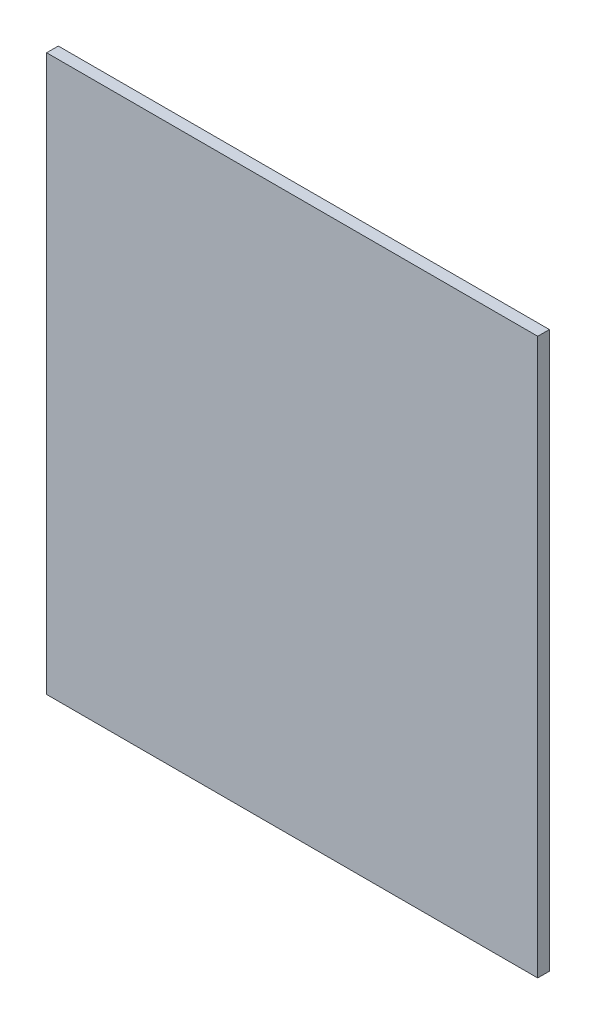
ISO-10303-21;
HEADER;
FILE_DESCRIPTION(('STEP AP214'),'2;1');
FILE_NAME('part.step','',(''),(''),'','','');
FILE_SCHEMA(('AUTOMOTIVE_DESIGN { 1 0 10303 214 1 1 1 1 }'));
ENDSEC;
DATA;
#1=APPLICATION_CONTEXT('core data for automotive mechanical design processes');
#2=APPLICATION_PROTOCOL_DEFINITION('international standard','automotive_design',2000,#1);
#3=PRODUCT_CONTEXT('',#1,'mechanical');
#4=PRODUCT('Part','Part','',(#3));
#5=PRODUCT_RELATED_PRODUCT_CATEGORY('part','',(#4));
#6=PRODUCT_DEFINITION_FORMATION('','',#4);
#7=PRODUCT_DEFINITION_CONTEXT('part definition',#1,'design');
#8=PRODUCT_DEFINITION('design','',#6,#7);
#9=PRODUCT_DEFINITION_SHAPE('','',#8);
#10=(LENGTH_UNIT() NAMED_UNIT(*) SI_UNIT(.MILLI.,.METRE.));
#11=(NAMED_UNIT(*) PLANE_ANGLE_UNIT() SI_UNIT($,.RADIAN.));
#12=(NAMED_UNIT(*) SI_UNIT($,.STERADIAN.) SOLID_ANGLE_UNIT());
#13=UNCERTAINTY_MEASURE_WITH_UNIT(LENGTH_MEASURE(1.E-05),#10,'distance_accuracy_value','');
#14=(GEOMETRIC_REPRESENTATION_CONTEXT(3) GLOBAL_UNCERTAINTY_ASSIGNED_CONTEXT((#13)) GLOBAL_UNIT_ASSIGNED_CONTEXT((#10,
#11,#12)) REPRESENTATION_CONTEXT('',''));
#15=CARTESIAN_POINT('',(0.,0.,0.));
#16=DIRECTION('',(0.,0.,1.));
#17=DIRECTION('',(1.,0.,0.));
#18=AXIS2_PLACEMENT_3D('',#15,#16,#17);
#19=CARTESIAN_POINT('',(0.,0.,12.7));
#20=DIRECTION('',(1.,0.,0.));
#21=DIRECTION('',(0.,0.,-1.));
#22=AXIS2_PLACEMENT_3D('',#19,#20,#21);
#23=PLANE('',#22);
#24=DIRECTION('',(0.,-1.,0.));
#25=VECTOR('',#24,1.);
#26=CARTESIAN_POINT('',(0.,0.,0.));
#27=LINE('',#26,#25);
#28=CARTESIAN_POINT('',(0.,605.,0.));
#29=VERTEX_POINT('',#28);
#30=CARTESIAN_POINT('',(0.,0.,0.));
#31=VERTEX_POINT('',#30);
#32=EDGE_CURVE('E107',#29,#31,#27,.T.);
#33=ORIENTED_EDGE('',*,*,#32,.T.);
#34=DIRECTION('',(0.,0.,-1.));
#35=VECTOR('',#34,1.);
#36=CARTESIAN_POINT('',(0.,0.,12.7));
#37=LINE('',#36,#35);
#38=CARTESIAN_POINT('',(0.,0.,12.7));
#39=VERTEX_POINT('',#38);
#40=EDGE_CURVE('E11',#39,#31,#37,.T.);
#41=ORIENTED_EDGE('',*,*,#40,.F.);
#42=DIRECTION('',(0.,-1.,0.));
#43=VECTOR('',#42,1.);
#44=CARTESIAN_POINT('',(0.,0.,12.7));
#45=LINE('',#44,#43);
#46=CARTESIAN_POINT('',(0.,605.,12.7));
#47=VERTEX_POINT('',#46);
#48=EDGE_CURVE('E91',#47,#39,#45,.T.);
#49=ORIENTED_EDGE('',*,*,#48,.F.);
#50=DIRECTION('',(0.,0.,-1.));
#51=VECTOR('',#50,1.);
#52=CARTESIAN_POINT('',(0.,605.,12.7));
#53=LINE('',#52,#51);
#54=EDGE_CURVE('E103',#47,#29,#53,.T.);
#55=ORIENTED_EDGE('',*,*,#54,.T.);
#56=EDGE_LOOP('',(#33,#41,#49,#55));
#57=FACE_BOUND('',#56,.T.);
#58=ADVANCED_FACE('F39',(#57),#23,.F.);
#59=CARTESIAN_POINT('',(0.,0.,12.7));
#60=DIRECTION('',(0.,1.,0.));
#61=DIRECTION('',(0.,0.,1.));
#62=AXIS2_PLACEMENT_3D('',#59,#60,#61);
#63=PLANE('',#62);
#64=DIRECTION('',(1.,0.,0.));
#65=VECTOR('',#64,1.);
#66=CARTESIAN_POINT('',(0.,0.,0.));
#67=LINE('',#66,#65);
#68=CARTESIAN_POINT('',(534.6,0.,0.));
#69=VERTEX_POINT('',#68);
#70=EDGE_CURVE('E96',#31,#69,#67,.T.);
#71=ORIENTED_EDGE('',*,*,#70,.T.);
#72=DIRECTION('',(0.,0.,-1.));
#73=VECTOR('',#72,1.);
#74=CARTESIAN_POINT('',(534.6,0.,12.7));
#75=LINE('',#74,#73);
#76=CARTESIAN_POINT('',(534.6,0.,12.7));
#77=VERTEX_POINT('',#76);
#78=EDGE_CURVE('E48',#77,#69,#75,.T.);
#79=ORIENTED_EDGE('',*,*,#78,.F.);
#80=DIRECTION('',(1.,0.,0.));
#81=VECTOR('',#80,1.);
#82=CARTESIAN_POINT('',(0.,0.,12.7));
#83=LINE('',#82,#81);
#84=EDGE_CURVE('E86',#39,#77,#83,.T.);
#85=ORIENTED_EDGE('',*,*,#84,.F.);
#86=ORIENTED_EDGE('',*,*,#40,.T.);
#87=EDGE_LOOP('',(#71,#79,#85,#86));
#88=FACE_BOUND('',#87,.T.);
#89=ADVANCED_FACE('F95',(#88),#63,.F.);
#90=CARTESIAN_POINT('',(534.6,0.,12.7));
#91=DIRECTION('',(-1.,0.,0.));
#92=DIRECTION('',(0.,0.,1.));
#93=AXIS2_PLACEMENT_3D('',#90,#91,#92);
#94=PLANE('',#93);
#95=DIRECTION('',(0.,1.,0.));
#96=VECTOR('',#95,1.);
#97=CARTESIAN_POINT('',(534.6,0.,0.));
#98=LINE('',#97,#96);
#99=CARTESIAN_POINT('',(534.6,605.,0.));
#100=VERTEX_POINT('',#99);
#101=EDGE_CURVE('E73',#69,#100,#98,.T.);
#102=ORIENTED_EDGE('',*,*,#101,.T.);
#103=DIRECTION('',(0.,0.,-1.));
#104=VECTOR('',#103,1.);
#105=CARTESIAN_POINT('',(534.6,605.,12.7));
#106=LINE('',#105,#104);
#107=CARTESIAN_POINT('',(534.6,605.,12.7));
#108=VERTEX_POINT('',#107);
#109=EDGE_CURVE('E98',#108,#100,#106,.T.);
#110=ORIENTED_EDGE('',*,*,#109,.F.);
#111=DIRECTION('',(0.,1.,0.));
#112=VECTOR('',#111,1.);
#113=CARTESIAN_POINT('',(534.6,0.,12.7));
#114=LINE('',#113,#112);
#115=EDGE_CURVE('E89',#77,#108,#114,.T.);
#116=ORIENTED_EDGE('',*,*,#115,.F.);
#117=ORIENTED_EDGE('',*,*,#78,.T.);
#118=EDGE_LOOP('',(#102,#110,#116,#117));
#119=FACE_BOUND('',#118,.T.);
#120=ADVANCED_FACE('F99',(#119),#94,.F.);
#121=CARTESIAN_POINT('',(0.,605.,12.7));
#122=DIRECTION('',(0.,-1.,0.));
#123=DIRECTION('',(0.,0.,-1.));
#124=AXIS2_PLACEMENT_3D('',#121,#122,#123);
#125=PLANE('',#124);
#126=DIRECTION('',(-1.,0.,0.));
#127=VECTOR('',#126,1.);
#128=CARTESIAN_POINT('',(0.,605.,0.));
#129=LINE('',#128,#127);
#130=EDGE_CURVE('E79',#100,#29,#129,.T.);
#131=ORIENTED_EDGE('',*,*,#130,.T.);
#132=ORIENTED_EDGE('',*,*,#54,.F.);
#133=DIRECTION('',(-1.,0.,0.));
#134=VECTOR('',#133,1.);
#135=CARTESIAN_POINT('',(0.,605.,12.7));
#136=LINE('',#135,#134);
#137=EDGE_CURVE('E56',#108,#47,#136,.T.);
#138=ORIENTED_EDGE('',*,*,#137,.F.);
#139=ORIENTED_EDGE('',*,*,#109,.T.);
#140=EDGE_LOOP('',(#131,#132,#138,#139));
#141=FACE_BOUND('',#140,.T.);
#142=ADVANCED_FACE('F120',(#141),#125,.F.);
#143=CARTESIAN_POINT('',(0.,0.,12.7));
#144=DIRECTION('',(0.,0.,-1.));
#145=DIRECTION('',(-1.,0.,0.));
#146=AXIS2_PLACEMENT_3D('',#143,#144,#145);
#147=PLANE('',#146);
#148=ORIENTED_EDGE('',*,*,#48,.T.);
#149=ORIENTED_EDGE('',*,*,#84,.T.);
#150=ORIENTED_EDGE('',*,*,#115,.T.);
#151=ORIENTED_EDGE('',*,*,#137,.T.);
#152=EDGE_LOOP('',(#148,#149,#150,#151));
#153=FACE_BOUND('',#152,.T.);
#154=ADVANCED_FACE('F87',(#153),#147,.F.);
#155=CARTESIAN_POINT('',(0.,0.,0.));
#156=DIRECTION('',(0.,0.,-1.));
#157=DIRECTION('',(-1.,0.,0.));
#158=AXIS2_PLACEMENT_3D('',#155,#156,#157);
#159=PLANE('',#158);
#160=ORIENTED_EDGE('',*,*,#32,.F.);
#161=ORIENTED_EDGE('',*,*,#130,.F.);
#162=ORIENTED_EDGE('',*,*,#101,.F.);
#163=ORIENTED_EDGE('',*,*,#70,.F.);
#164=EDGE_LOOP('',(#160,#161,#162,#163));
#165=FACE_BOUND('',#164,.T.);
#166=ADVANCED_FACE('F123',(#165),#159,.T.);
#167=CLOSED_SHELL('',(#58,#89,#120,#142,#154,#166));
#168=MANIFOLD_SOLID_BREP('B2',#167);
#169=ADVANCED_BREP_SHAPE_REPRESENTATION('',(#18,#168),#14);
#170=SHAPE_DEFINITION_REPRESENTATION(#9,#169);
ENDSEC;
END-ISO-10303-21;
